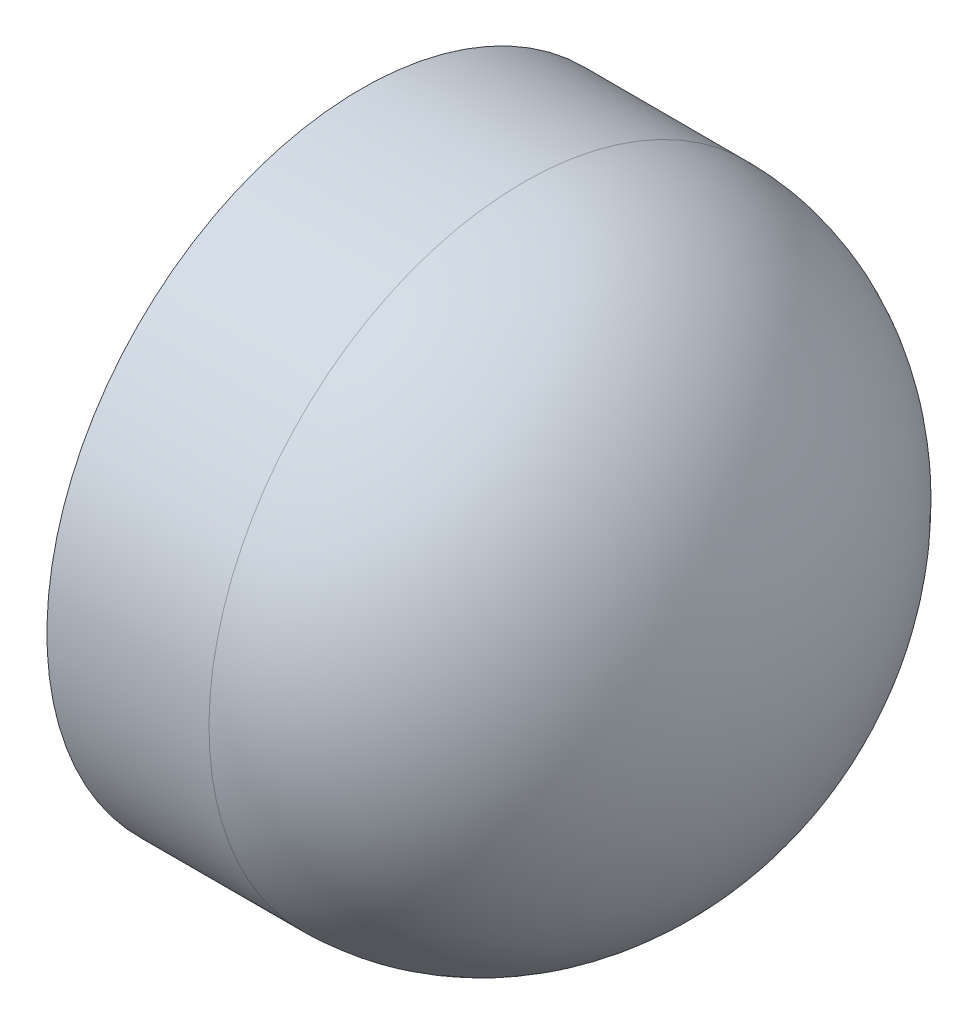
ISO-10303-21;
HEADER;
FILE_DESCRIPTION(('STEP AP214'),'2;1');
FILE_NAME('part.step','',(''),(''),'','','');
FILE_SCHEMA(('AUTOMOTIVE_DESIGN { 1 0 10303 214 1 1 1 1 }'));
ENDSEC;
DATA;
#1=APPLICATION_CONTEXT('core data for automotive mechanical design processes');
#2=APPLICATION_PROTOCOL_DEFINITION('international standard','automotive_design',2000,#1);
#3=PRODUCT_CONTEXT('',#1,'mechanical');
#4=PRODUCT('Part','Part','',(#3));
#5=PRODUCT_RELATED_PRODUCT_CATEGORY('part','',(#4));
#6=PRODUCT_DEFINITION_FORMATION('','',#4);
#7=PRODUCT_DEFINITION_CONTEXT('part definition',#1,'design');
#8=PRODUCT_DEFINITION('design','',#6,#7);
#9=PRODUCT_DEFINITION_SHAPE('','',#8);
#10=(LENGTH_UNIT() NAMED_UNIT(*) SI_UNIT(.MILLI.,.METRE.));
#11=(NAMED_UNIT(*) PLANE_ANGLE_UNIT() SI_UNIT($,.RADIAN.));
#12=(NAMED_UNIT(*) SI_UNIT($,.STERADIAN.) SOLID_ANGLE_UNIT());
#13=UNCERTAINTY_MEASURE_WITH_UNIT(LENGTH_MEASURE(1.E-05),#10,'distance_accuracy_value','');
#14=(GEOMETRIC_REPRESENTATION_CONTEXT(3) GLOBAL_UNCERTAINTY_ASSIGNED_CONTEXT((#13)) GLOBAL_UNIT_ASSIGNED_CONTEXT((#10,
#11,#12)) REPRESENTATION_CONTEXT('',''));
#15=CARTESIAN_POINT('',(0.,0.,0.));
#16=DIRECTION('',(0.,0.,1.));
#17=DIRECTION('',(1.,0.,0.));
#18=AXIS2_PLACEMENT_3D('',#15,#16,#17);
#19=CARTESIAN_POINT('',(2.5,4.7850708142114,8.49192718187378));
#20=DIRECTION('',(-1.,0.,0.));
#21=DIRECTION('',(0.,0.,1.));
#22=AXIS2_PLACEMENT_3D('',#19,#20,#21);
#23=CYLINDRICAL_SURFACE('',#22,4.85);
#24=CARTESIAN_POINT('',(2.5,4.7850708142114,8.49192718187378));
#25=DIRECTION('',(1.,0.,0.));
#26=DIRECTION('',(0.,0.,-1.));
#27=AXIS2_PLACEMENT_3D('',#24,#25,#26);
#28=CIRCLE('',#27,4.85);
#29=CARTESIAN_POINT('',(2.5,4.7850708142114,3.64192718187378));
#30=VERTEX_POINT('',#29);
#31=EDGE_CURVE('E47',#30,#30,#28,.T.);
#32=ORIENTED_EDGE('',*,*,#31,.F.);
#33=EDGE_LOOP('',(#32));
#34=FACE_BOUND('',#33,.T.);
#35=CARTESIAN_POINT('',(0.,4.7850708142114,8.49192718187378));
#36=DIRECTION('',(1.,0.,0.));
#37=DIRECTION('',(0.,0.,-1.));
#38=AXIS2_PLACEMENT_3D('',#35,#36,#37);
#39=CIRCLE('',#38,4.85);
#40=CARTESIAN_POINT('',(0.,0.172858763578861,6.99192718187377));
#41=VERTEX_POINT('',#40);
#42=CARTESIAN_POINT('',(0.,0.17285876357886,9.99192718187377));
#43=VERTEX_POINT('',#42);
#44=EDGE_CURVE('E79',#41,#43,#39,.T.);
#45=ORIENTED_EDGE('',*,*,#44,.T.);
#46=CARTESIAN_POINT('',(0.,0.17285876357886,9.99192718187377));
#47=CARTESIAN_POINT('',(0.0411143000281396,0.172862425041795,9.99192810701036));
#48=CARTESIAN_POINT('',(0.0822078173248938,0.172308313201546,9.99023571174803));
#49=CARTESIAN_POINT('',(0.164079818898569,0.170121919356776,9.98349196033429));
#50=CARTESIAN_POINT('',(0.204858375449611,0.168489892615905,9.97844139943635));
#51=CARTESIAN_POINT('',(0.326055617481371,0.162047733881612,9.9583400679915));
#52=CARTESIAN_POINT('',(0.405629124514728,0.155690998920845,9.9383391884601));
#53=CARTESIAN_POINT('',(0.560074495014036,0.139614593277567,9.88583496541873));
#54=CARTESIAN_POINT('',(0.634948241850612,0.129896280002986,9.85333666778486));
#55=CARTESIAN_POINT('',(0.778238216558603,0.108198629641495,9.77681776092745));
#56=CARTESIAN_POINT('',(0.846651157062789,0.0962181507262428,9.73279132851758));
#57=CARTESIAN_POINT('',(0.977322514304058,0.0708986550341083,9.63289555286068));
#58=CARTESIAN_POINT('',(1.03933154217718,0.0575294677285883,9.57670770275408));
#59=CARTESIAN_POINT('',(1.15321724294133,0.0311950632459928,9.45476230492772));
#60=CARTESIAN_POINT('',(1.20509218096997,0.0182299155554953,9.38900312204091));
#61=CARTESIAN_POINT('',(1.29833554078015,-0.00618167149254255,9.24798551880824));
#62=CARTESIAN_POINT('',(1.33944629792576,-0.0175881931249334,9.17254921354675));
#63=CARTESIAN_POINT('',(1.40829801776135,-0.0372428449302181,9.01542357382584));
#64=CARTESIAN_POINT('',(1.4360425976685,-0.0454918294862121,8.93373593807325));
#65=CARTESIAN_POINT('',(1.47654161112776,-0.0576879216860001,8.76904820183973));
#66=CARTESIAN_POINT('',(1.48972439950102,-0.0617576958784445,8.68616268944478));
#67=CARTESIAN_POINT('',(1.50208222580777,-0.0655697725485191,8.5192613430609));
#68=CARTESIAN_POINT('',(1.50126009890199,-0.0653129509040835,8.43524574128874));
#69=CARTESIAN_POINT('',(1.48591415951758,-0.0605863504147797,8.27148458785665));
#70=CARTESIAN_POINT('',(1.47185481124192,-0.0562593883854229,8.19169073315964));
#71=CARTESIAN_POINT('',(1.43119494256459,-0.044053878072001,8.03565710245419));
#72=CARTESIAN_POINT('',(1.40459375202915,-0.0361751400109762,7.95941751659613));
#73=CARTESIAN_POINT('',(1.33930251016348,-0.0175580564915899,7.81157482416615));
#74=CARTESIAN_POINT('',(1.30047006438868,-0.00678626006619455,7.74003898910844));
#75=CARTESIAN_POINT('',(1.21193261293328,0.0164798228110235,7.6043542471452));
#76=CARTESIAN_POINT('',(1.16222502311623,0.0289745183943732,7.54020710146914));
#77=CARTESIAN_POINT('',(1.05096359626178,0.0549560865725959,7.41835544379358));
#78=CARTESIAN_POINT('',(0.989009416622748,0.0684626416480363,7.36102021496838));
#79=CARTESIAN_POINT('',(0.85622234213322,0.0945072410398348,7.25743359998939));
#80=CARTESIAN_POINT('',(0.785386805406564,0.10704499537258,7.21118552382463));
#81=CARTESIAN_POINT('',(0.635809491222828,0.12983362770871,7.13066164081031));
#82=CARTESIAN_POINT('',(0.556987643405196,0.140057154796174,7.09652656140031));
#83=CARTESIAN_POINT('',(0.394364721172047,0.156731724512124,7.04216897601139));
#84=CARTESIAN_POINT('',(0.3105715364142,0.163188577387019,7.02192503384574));
#85=CARTESIAN_POINT('',(0.188320836636742,0.169167960729992,7.00331411843699));
#86=CARTESIAN_POINT('',(0.150770552612748,0.170548733632281,6.99904483526919));
#87=CARTESIAN_POINT('',(0.0754866196747978,0.172394386783942,6.99335374545354));
#88=CARTESIAN_POINT('',(0.0377533101163636,0.172860575056271,6.99192787216237));
#89=CARTESIAN_POINT('',(0.,0.172858763578861,6.99192718187377));
#90=B_SPLINE_CURVE_WITH_KNOTS('',3,(#46,#47,#48,#49,#50,#51,#52,#53,#54,#55,#56,#57,#58,#59,#60,
#61,#62,#63,#64,#65,#66,#67,#68,#69,#70,#71,#72,#73,#74,#75,#76,#77,#78,#79,#80,#81,#82,#83,#84,
#85,#86,#87,#88,#89),.UNSPECIFIED.,.F.,.F.,(4,2,2,2,2,2,2,2,2,2,2,2,2,2,2,2,2,2,2,2,2,4),(0.,
0.123263688758538,0.246498197604305,0.492099123737708,0.737600991577912,0.983227109376233,
1.2362980247862,1.48941222570321,1.74812290794372,2.00676353730939,2.25757463491377,
2.50833495882122,2.75061214697928,2.99290228192181,3.23812442195345,3.48340489473408,
3.73868528574554,3.99404179422221,4.25227471588844,4.51010824234586,4.62346117663527,
4.7366518770137),.UNSPECIFIED.);
#91=EDGE_CURVE('E80',#43,#41,#90,.T.);
#92=ORIENTED_EDGE('',*,*,#91,.T.);
#93=EDGE_LOOP('',(#45,#92));
#94=FACE_BOUND('',#93,.T.);
#95=ADVANCED_FACE('F33',(#34,#94),#23,.T.);
#96=CARTESIAN_POINT('',(2.5,4.7850708142114,8.49192718187378));
#97=DIRECTION('',(0.,1.,0.));
#98=DIRECTION('',(0.,0.,-1.));
#99=AXIS2_PLACEMENT_3D('',#96,#97,#98);
#100=ELLIPSE('',#99,4.85,4.);
#101=TRIMMED_CURVE('',#100,(PARAMETER_VALUE(4.71238898038469)),
(PARAMETER_VALUE(7.85398163397448)),.T.,.PARAMETER.);
#102=CARTESIAN_POINT('',(-1.5,4.7850708142114,8.49192718187378));
#103=DIRECTION('',(1.,0.,0.));
#104=AXIS1_PLACEMENT('',#102,#103);
#105=SURFACE_OF_REVOLUTION('',#101,#104);
#106=CARTESIAN_POINT('',(6.5,4.7850708142114,8.49192718187378));
#107=VERTEX_POINT('',#106);
#108=VERTEX_LOOP('',#107);
#109=FACE_BOUND('',#108,.T.);
#110=ORIENTED_EDGE('',*,*,#31,.T.);
#111=EDGE_LOOP('',(#110));
#112=FACE_BOUND('',#111,.T.);
#113=ADVANCED_FACE('F35',(#109,#112),#105,.F.);
#114=CARTESIAN_POINT('',(0.,4.7850708142114,8.49192718187378));
#115=DIRECTION('',(1.,0.,0.));
#116=DIRECTION('',(0.,0.,-1.));
#117=AXIS2_PLACEMENT_3D('',#114,#115,#116);
#118=PLANE('',#117);
#119=ORIENTED_EDGE('',*,*,#44,.F.);
#120=DIRECTION('',(0.,1.,0.));
#121=VECTOR('',#120,1.);
#122=CARTESIAN_POINT('',(0.,-4.,6.99192718187377));
#123=LINE('',#122,#121);
#124=CARTESIAN_POINT('',(0.,0.808577384064682,6.99192718187377));
#125=VERTEX_POINT('',#124);
#126=EDGE_CURVE('E69',#41,#125,#123,.T.);
#127=ORIENTED_EDGE('',*,*,#126,.T.);
#128=CARTESIAN_POINT('',(0.,4.7850708142114,8.49192718187378));
#129=DIRECTION('',(1.,0.,0.));
#130=DIRECTION('',(0.,0.,-1.));
#131=AXIS2_PLACEMENT_3D('',#128,#129,#130);
#132=CIRCLE('',#131,4.25);
#133=CARTESIAN_POINT('',(0.,0.808577384064681,9.99192718187377));
#134=VERTEX_POINT('',#133);
#135=EDGE_CURVE('E77',#125,#134,#132,.T.);
#136=ORIENTED_EDGE('',*,*,#135,.T.);
#137=DIRECTION('',(0.,1.,0.));
#138=VECTOR('',#137,1.);
#139=CARTESIAN_POINT('',(0.,-4.,9.99192718187377));
#140=LINE('',#139,#138);
#141=EDGE_CURVE('E53',#134,#43,#140,.F.);
#142=ORIENTED_EDGE('',*,*,#141,.T.);
#143=EDGE_LOOP('',(#119,#127,#136,#142));
#144=FACE_BOUND('',#143,.T.);
#145=ADVANCED_FACE('F76',(#144),#118,.F.);
#146=CARTESIAN_POINT('',(2.5,4.7850708142114,8.49192718187378));
#147=DIRECTION('',(-1.,0.,0.));
#148=DIRECTION('',(0.,0.,1.));
#149=AXIS2_PLACEMENT_3D('',#146,#147,#148);
#150=CYLINDRICAL_SURFACE('',#149,4.25);
#151=CARTESIAN_POINT('',(0.,0.808577384064681,9.99192718187377));
#152=CARTESIAN_POINT('',(0.0407796384129904,0.808581781815389,9.991928474221));
#153=CARTESIAN_POINT('',(0.081538274030708,0.807949287454353,9.99026313113278));
#154=CARTESIAN_POINT('',(0.162735995212975,0.805454948989775,9.98362970747548));
#155=CARTESIAN_POINT('',(0.203175172823775,0.80359347312101,9.97866261619287));
#156=CARTESIAN_POINT('',(0.323305189249857,0.79625170357957,9.95890708677479));
#157=CARTESIAN_POINT('',(0.402146862123797,0.789013339723098,9.93926380200993));
#158=CARTESIAN_POINT('',(0.555132012889937,0.770736108807767,9.88776082401953));
#159=CARTESIAN_POINT('',(0.629278659783418,0.759699838306749,9.85590947553083));
#160=CARTESIAN_POINT('',(0.771247344820652,0.735079687896863,9.78096711055218));
#161=CARTESIAN_POINT('',(0.839064860535609,0.721494006883284,9.73786813939182));
#162=CARTESIAN_POINT('',(0.969361593205246,0.692643725886605,9.63964533178877));
#163=CARTESIAN_POINT('',(1.03152219356066,0.677333896298092,9.5841121968377));
#164=CARTESIAN_POINT('',(1.14587087354974,0.647139743887556,9.46346681712754));
#165=CARTESIAN_POINT('',(1.19805711066183,0.632255500113194,9.39835280645831));
#166=CARTESIAN_POINT('',(1.29246888147694,0.604056414864515,9.25801050836437));
#167=CARTESIAN_POINT('',(1.33435292842186,0.590801242670252,9.18253944472228));
#168=CARTESIAN_POINT('',(1.40469967483913,0.567895256032156,9.02507586001098));
#169=CARTESIAN_POINT('',(1.43316688521361,0.558243230394303,8.94308554164457));
#170=CARTESIAN_POINT('',(1.47477102180833,0.543952817616509,8.77827024200025));
#171=CARTESIAN_POINT('',(1.48845772059005,0.539135142605364,8.69559988038526));
#172=CARTESIAN_POINT('',(1.50186667992433,0.534416580331295,8.52900327799719));
#173=CARTESIAN_POINT('',(1.50159270713566,0.534514366852254,8.44507738208268));
#174=CARTESIAN_POINT('',(1.48742324733578,0.539497796535898,8.28226832558819));
#175=CARTESIAN_POINT('',(1.47412635270786,0.54417303624981,8.20332554537614));
#176=CARTESIAN_POINT('',(1.43528638525137,0.557516402986721,8.04887485615827));
#177=CARTESIAN_POINT('',(1.40974262190027,0.566184755154691,7.97336714109667));
#178=CARTESIAN_POINT('',(1.34681790737165,0.586794294909121,7.82669023065179));
#179=CARTESIAN_POINT('',(1.30927747587303,0.598779267049762,7.7555958593816));
#180=CARTESIAN_POINT('',(1.22356037175821,0.624790156833767,7.62054819462726));
#181=CARTESIAN_POINT('',(1.17538052578555,0.63881668297321,7.55659704029653));
#182=CARTESIAN_POINT('',(1.06680073954178,0.668312776461519,7.43410893376909));
#183=CARTESIAN_POINT('',(1.00589355144603,0.683819448506969,7.37602993908977));
#184=CARTESIAN_POINT('',(0.875075113961974,0.713926990230761,7.27074143937898));
#185=CARTESIAN_POINT('',(0.805160716074965,0.728527540514475,7.22353575130887));
#186=CARTESIAN_POINT('',(0.656685043387085,0.75539176323594,7.14058401392437));
#187=CARTESIAN_POINT('',(0.577989662508173,0.767608119261941,7.10506193189746));
#188=CARTESIAN_POINT('',(0.415231716602762,0.787766601752991,7.04797781936328));
#189=CARTESIAN_POINT('',(0.331178091891203,0.795715649742152,7.02639317089436));
#190=CARTESIAN_POINT('',(0.205238474984835,0.803492468806805,7.00546215901224));
#191=CARTESIAN_POINT('',(0.164357374359455,0.805393070943165,7.00038974536649));
#192=CARTESIAN_POINT('',(0.0823251068196484,0.807936868493564,6.99362386020037));
#193=CARTESIAN_POINT('',(0.0411743024971084,0.808581500353504,6.99192652857252));
#194=CARTESIAN_POINT('',(0.,0.808577384064683,6.99192718187377));
#195=B_SPLINE_CURVE_WITH_KNOTS('',3,(#151,#152,#153,#154,#155,#156,#157,#158,#159,#160,#161,
#162,#163,#164,#165,#166,#167,#168,#169,#170,#171,#172,#173,#174,#175,#176,#177,#178,#179,#180,
#181,#182,#183,#184,#185,#186,#187,#188,#189,#190,#191,#192,#193,#194),.UNSPECIFIED.,.F.,.F.,(4,
2,2,2,2,2,2,2,2,2,2,2,2,2,2,2,2,2,2,2,2,4),(0.,0.122259131519323,0.244481647642334,
0.487925258746724,0.731202761579157,0.974652786340876,1.22776322744737,1.48092037947189,
1.74158895001521,2.00216981801449,2.25268356110179,2.50312971469053,2.74257981557247,
2.98204341910082,3.22483295675743,3.46769500788649,3.72325613147573,3.97890683088378,
4.23920582248006,4.4990813266186,4.62265980241756,4.74609685907447),.UNSPECIFIED.);
#196=EDGE_CURVE('E11',#134,#125,#195,.T.);
#197=ORIENTED_EDGE('',*,*,#196,.F.);
#198=ORIENTED_EDGE('',*,*,#135,.F.);
#199=EDGE_LOOP('',(#197,#198));
#200=FACE_BOUND('',#199,.T.);
#201=CARTESIAN_POINT('',(2.5,4.7850708142114,8.49192718187378));
#202=DIRECTION('',(1.,0.,0.));
#203=DIRECTION('',(0.,0.,-1.));
#204=AXIS2_PLACEMENT_3D('',#201,#202,#203);
#205=CIRCLE('',#204,4.25);
#206=CARTESIAN_POINT('',(2.5,4.7850708142114,4.24192718187378));
#207=VERTEX_POINT('',#206);
#208=EDGE_CURVE('E84',#207,#207,#205,.T.);
#209=ORIENTED_EDGE('',*,*,#208,.T.);
#210=EDGE_LOOP('',(#209));
#211=FACE_BOUND('',#210,.T.);
#212=ADVANCED_FACE('F82',(#200,#211),#150,.F.);
#213=CARTESIAN_POINT('',(2.5,4.7850708142114,8.49192718187378));
#214=DIRECTION('',(0.,1.,0.));
#215=DIRECTION('',(0.,0.,-1.));
#216=AXIS2_PLACEMENT_3D('',#213,#214,#215);
#217=ELLIPSE('',#216,4.85,4.);
#218=TRIMMED_CURVE('',#217,(PARAMETER_VALUE(4.71238898038469)),
(PARAMETER_VALUE(7.85398163397448)),.T.,.PARAMETER.);
#219=CARTESIAN_POINT('',(-1.5,4.7850708142114,8.49192718187378));
#220=DIRECTION('',(1.,0.,0.));
#221=AXIS1_PLACEMENT('',#219,#220);
#222=SURFACE_OF_REVOLUTION('',#218,#221);
#223=OFFSET_SURFACE('',#222,0.6,.F.);
#224=CARTESIAN_POINT('',(5.9,4.7850708142114,8.49192718187378));
#225=VERTEX_POINT('',#224);
#226=VERTEX_LOOP('',#225);
#227=FACE_BOUND('',#226,.T.);
#228=ORIENTED_EDGE('',*,*,#208,.F.);
#229=EDGE_LOOP('',(#228));
#230=FACE_BOUND('',#229,.T.);
#231=ADVANCED_FACE('F97',(#227,#230),#223,.T.);
#232=CARTESIAN_POINT('',(0.,-4.,8.49192718187377));
#233=DIRECTION('',(0.,1.,0.));
#234=DIRECTION('',(0.,0.,1.));
#235=AXIS2_PLACEMENT_3D('',#232,#233,#234);
#236=CYLINDRICAL_SURFACE('',#235,1.5);
#237=ORIENTED_EDGE('',*,*,#141,.F.);
#238=ORIENTED_EDGE('',*,*,#196,.T.);
#239=ORIENTED_EDGE('',*,*,#126,.F.);
#240=ORIENTED_EDGE('',*,*,#91,.F.);
#241=EDGE_LOOP('',(#237,#238,#239,#240));
#242=FACE_BOUND('',#241,.T.);
#243=ADVANCED_FACE('F68',(#242),#236,.F.);
#244=CLOSED_SHELL('',(#95,#113,#145,#212,#231,#243));
#245=MANIFOLD_SOLID_BREP('B2',#244);
#246=ADVANCED_BREP_SHAPE_REPRESENTATION('',(#18,#245),#14);
#247=SHAPE_DEFINITION_REPRESENTATION(#9,#246);
ENDSEC;
END-ISO-10303-21;
